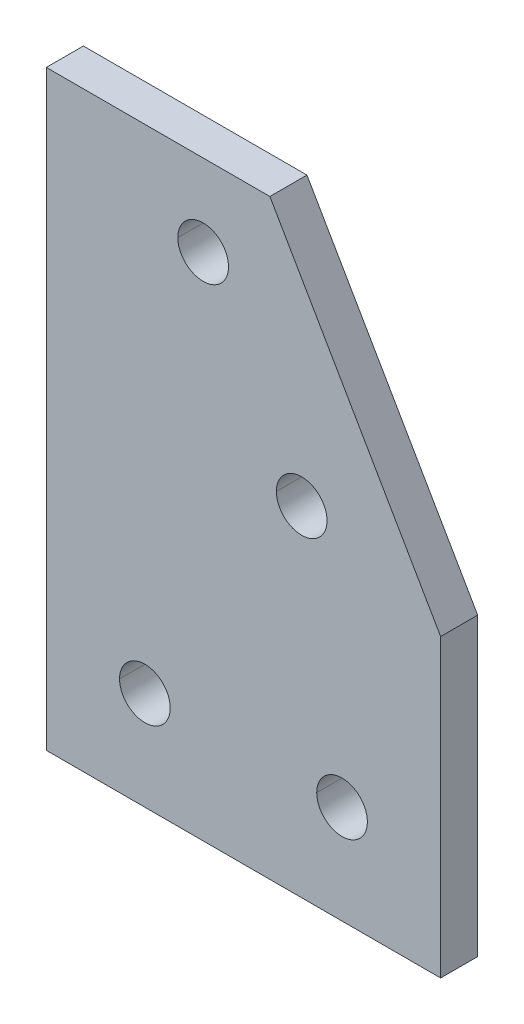
ISO-10303-21;
HEADER;
FILE_DESCRIPTION(('STEP AP214'),'2;1');
FILE_NAME('part.step','',(''),(''),'','','');
FILE_SCHEMA(('AUTOMOTIVE_DESIGN { 1 0 10303 214 1 1 1 1 }'));
ENDSEC;
DATA;
#1=APPLICATION_CONTEXT('core data for automotive mechanical design processes');
#2=APPLICATION_PROTOCOL_DEFINITION('international standard','automotive_design',2000,#1);
#3=PRODUCT_CONTEXT('',#1,'mechanical');
#4=PRODUCT('Part','Part','',(#3));
#5=PRODUCT_RELATED_PRODUCT_CATEGORY('part','',(#4));
#6=PRODUCT_DEFINITION_FORMATION('','',#4);
#7=PRODUCT_DEFINITION_CONTEXT('part definition',#1,'design');
#8=PRODUCT_DEFINITION('design','',#6,#7);
#9=PRODUCT_DEFINITION_SHAPE('','',#8);
#10=(LENGTH_UNIT() NAMED_UNIT(*) SI_UNIT(.MILLI.,.METRE.));
#11=(NAMED_UNIT(*) PLANE_ANGLE_UNIT() SI_UNIT($,.RADIAN.));
#12=(NAMED_UNIT(*) SI_UNIT($,.STERADIAN.) SOLID_ANGLE_UNIT());
#13=UNCERTAINTY_MEASURE_WITH_UNIT(LENGTH_MEASURE(1.E-05),#10,'distance_accuracy_value','');
#14=(GEOMETRIC_REPRESENTATION_CONTEXT(3) GLOBAL_UNCERTAINTY_ASSIGNED_CONTEXT((#13)) GLOBAL_UNIT_ASSIGNED_CONTEXT((#10,
#11,#12)) REPRESENTATION_CONTEXT('',''));
#15=CARTESIAN_POINT('',(0.,0.,0.));
#16=DIRECTION('',(0.,0.,1.));
#17=DIRECTION('',(1.,0.,0.));
#18=AXIS2_PLACEMENT_3D('',#15,#16,#17);
#19=CARTESIAN_POINT('',(-25.4,38.1,-2.3876));
#20=DIRECTION('',(0.,-1.,0.));
#21=DIRECTION('',(0.,0.,1.));
#22=AXIS2_PLACEMENT_3D('',#19,#20,#21);
#23=PLANE('',#22);
#24=DIRECTION('',(1.,0.,0.));
#25=VECTOR('',#24,1.);
#26=CARTESIAN_POINT('',(-25.4,38.1,2.3876));
#27=LINE('',#26,#25);
#28=CARTESIAN_POINT('',(-25.4,38.1,2.3876));
#29=VERTEX_POINT('',#28);
#30=CARTESIAN_POINT('',(3.402838,38.1,2.3876));
#31=VERTEX_POINT('',#30);
#32=EDGE_CURVE('E11',#29,#31,#27,.T.);
#33=ORIENTED_EDGE('',*,*,#32,.T.);
#34=DIRECTION('',(0.,0.,1.));
#35=VECTOR('',#34,1.);
#36=CARTESIAN_POINT('',(3.402838,38.1,-2.3876));
#37=LINE('',#36,#35);
#38=CARTESIAN_POINT('',(3.402838,38.1,-2.3876));
#39=VERTEX_POINT('',#38);
#40=EDGE_CURVE('E25',#39,#31,#37,.T.);
#41=ORIENTED_EDGE('',*,*,#40,.F.);
#42=DIRECTION('',(1.,0.,0.));
#43=VECTOR('',#42,1.);
#44=CARTESIAN_POINT('',(-25.4,38.1,-2.3876));
#45=LINE('',#44,#43);
#46=CARTESIAN_POINT('',(-25.4,38.1,-2.3876));
#47=VERTEX_POINT('',#46);
#48=EDGE_CURVE('E339',#47,#39,#45,.T.);
#49=ORIENTED_EDGE('',*,*,#48,.F.);
#50=DIRECTION('',(0.,0.,1.));
#51=VECTOR('',#50,1.);
#52=CARTESIAN_POINT('',(-25.4,38.1,-2.3876));
#53=LINE('',#52,#51);
#54=EDGE_CURVE('E334',#47,#29,#53,.T.);
#55=ORIENTED_EDGE('',*,*,#54,.T.);
#56=EDGE_LOOP('',(#33,#41,#49,#55));
#57=FACE_BOUND('',#56,.T.);
#58=ADVANCED_FACE('F16',(#57),#23,.F.);
#59=CARTESIAN_POINT('',(-25.4,-38.1,-2.3876));
#60=DIRECTION('',(1.,0.,0.));
#61=DIRECTION('',(0.,0.,-1.));
#62=AXIS2_PLACEMENT_3D('',#59,#60,#61);
#63=PLANE('',#62);
#64=DIRECTION('',(0.,1.,0.));
#65=VECTOR('',#64,1.);
#66=CARTESIAN_POINT('',(-25.4,-38.1,2.3876));
#67=LINE('',#66,#65);
#68=CARTESIAN_POINT('',(-25.4,-38.1,2.3876));
#69=VERTEX_POINT('',#68);
#70=EDGE_CURVE('E328',#69,#29,#67,.T.);
#71=ORIENTED_EDGE('',*,*,#70,.T.);
#72=ORIENTED_EDGE('',*,*,#54,.F.);
#73=DIRECTION('',(0.,1.,0.));
#74=VECTOR('',#73,1.);
#75=CARTESIAN_POINT('',(-25.4,-38.1,-2.3876));
#76=LINE('',#75,#74);
#77=CARTESIAN_POINT('',(-25.4,-38.1,-2.3876));
#78=VERTEX_POINT('',#77);
#79=EDGE_CURVE('E322',#78,#47,#76,.T.);
#80=ORIENTED_EDGE('',*,*,#79,.F.);
#81=DIRECTION('',(0.,0.,1.));
#82=VECTOR('',#81,1.);
#83=CARTESIAN_POINT('',(-25.4,-38.1,-2.3876));
#84=LINE('',#83,#82);
#85=EDGE_CURVE('E317',#78,#69,#84,.T.);
#86=ORIENTED_EDGE('',*,*,#85,.T.);
#87=EDGE_LOOP('',(#71,#72,#80,#86));
#88=FACE_BOUND('',#87,.T.);
#89=ADVANCED_FACE('F366',(#88),#63,.F.);
#90=CARTESIAN_POINT('',(25.4,-38.1,-2.3876));
#91=DIRECTION('',(0.,1.,0.));
#92=DIRECTION('',(0.,0.,-1.));
#93=AXIS2_PLACEMENT_3D('',#90,#91,#92);
#94=PLANE('',#93);
#95=DIRECTION('',(-1.,0.,0.));
#96=VECTOR('',#95,1.);
#97=CARTESIAN_POINT('',(25.4,-38.1,2.3876));
#98=LINE('',#97,#96);
#99=CARTESIAN_POINT('',(25.4,-38.1,2.3876));
#100=VERTEX_POINT('',#99);
#101=EDGE_CURVE('E311',#100,#69,#98,.T.);
#102=ORIENTED_EDGE('',*,*,#101,.T.);
#103=ORIENTED_EDGE('',*,*,#85,.F.);
#104=DIRECTION('',(-1.,0.,0.));
#105=VECTOR('',#104,1.);
#106=CARTESIAN_POINT('',(25.4,-38.1,-2.3876));
#107=LINE('',#106,#105);
#108=CARTESIAN_POINT('',(25.4,-38.1,-2.3876));
#109=VERTEX_POINT('',#108);
#110=EDGE_CURVE('E305',#109,#78,#107,.T.);
#111=ORIENTED_EDGE('',*,*,#110,.F.);
#112=DIRECTION('',(0.,0.,1.));
#113=VECTOR('',#112,1.);
#114=CARTESIAN_POINT('',(25.4,-38.1,-2.3876));
#115=LINE('',#114,#113);
#116=EDGE_CURVE('E300',#109,#100,#115,.T.);
#117=ORIENTED_EDGE('',*,*,#116,.T.);
#118=EDGE_LOOP('',(#102,#103,#111,#117));
#119=FACE_BOUND('',#118,.T.);
#120=ADVANCED_FACE('F369',(#119),#94,.F.);
#121=CARTESIAN_POINT('',(25.4,0.,-2.3876));
#122=DIRECTION('',(-1.,0.,0.));
#123=DIRECTION('',(0.,0.,1.));
#124=AXIS2_PLACEMENT_3D('',#121,#122,#123);
#125=PLANE('',#124);
#126=DIRECTION('',(0.,-1.,0.));
#127=VECTOR('',#126,1.);
#128=CARTESIAN_POINT('',(25.4,0.,2.3876));
#129=LINE('',#128,#127);
#130=CARTESIAN_POINT('',(25.4,0.,2.3876));
#131=VERTEX_POINT('',#130);
#132=EDGE_CURVE('E294',#131,#100,#129,.T.);
#133=ORIENTED_EDGE('',*,*,#132,.T.);
#134=ORIENTED_EDGE('',*,*,#116,.F.);
#135=DIRECTION('',(0.,-1.,0.));
#136=VECTOR('',#135,1.);
#137=CARTESIAN_POINT('',(25.4,0.,-2.3876));
#138=LINE('',#137,#136);
#139=CARTESIAN_POINT('',(25.4,0.,-2.3876));
#140=VERTEX_POINT('',#139);
#141=EDGE_CURVE('E288',#140,#109,#138,.T.);
#142=ORIENTED_EDGE('',*,*,#141,.F.);
#143=DIRECTION('',(0.,0.,1.));
#144=VECTOR('',#143,1.);
#145=CARTESIAN_POINT('',(25.4,0.,-2.3876));
#146=LINE('',#145,#144);
#147=EDGE_CURVE('E283',#140,#131,#146,.T.);
#148=ORIENTED_EDGE('',*,*,#147,.T.);
#149=EDGE_LOOP('',(#133,#134,#142,#148));
#150=FACE_BOUND('',#149,.T.);
#151=ADVANCED_FACE('F361',(#150),#125,.F.);
#152=CARTESIAN_POINT('',(3.402838,38.1,-2.3876));
#153=DIRECTION('',(-0.866024254729786,-0.500001990215758,0.));
#154=DIRECTION('',(-0.500001990215758,0.866024254729786,0.));
#155=AXIS2_PLACEMENT_3D('',#152,#153,#154);
#156=PLANE('',#155);
#157=DIRECTION('',(0.500001990215758,-0.866024254729786,0.));
#158=VECTOR('',#157,1.);
#159=CARTESIAN_POINT('',(3.402838,38.1,2.3876));
#160=LINE('',#159,#158);
#161=EDGE_CURVE('E277',#31,#131,#160,.T.);
#162=ORIENTED_EDGE('',*,*,#161,.T.);
#163=ORIENTED_EDGE('',*,*,#147,.F.);
#164=DIRECTION('',(0.500001990215758,-0.866024254729786,0.));
#165=VECTOR('',#164,1.);
#166=CARTESIAN_POINT('',(3.402838,38.1,-2.3876));
#167=LINE('',#166,#165);
#168=EDGE_CURVE('E271',#39,#140,#167,.T.);
#169=ORIENTED_EDGE('',*,*,#168,.F.);
#170=ORIENTED_EDGE('',*,*,#40,.T.);
#171=EDGE_LOOP('',(#162,#163,#169,#170));
#172=FACE_BOUND('',#171,.T.);
#173=ADVANCED_FACE('F353',(#172),#156,.F.);
#174=CARTESIAN_POINT('',(0.,-38.1,-2.3876));
#175=DIRECTION('',(0.,0.,-1.));
#176=DIRECTION('',(-1.,0.,0.));
#177=AXIS2_PLACEMENT_3D('',#174,#175,#176);
#178=PLANE('',#177);
#179=CARTESIAN_POINT('',(12.7,-25.4,-2.3876));
#180=DIRECTION('',(0.,0.,-1.));
#181=DIRECTION('',(-1.,0.,0.));
#182=AXIS2_PLACEMENT_3D('',#179,#180,#181);
#183=CIRCLE('',#182,3.2639);
#184=CARTESIAN_POINT('',(9.4361,-25.4,-2.3876));
#185=VERTEX_POINT('',#184);
#186=CARTESIAN_POINT('',(15.9639,-25.4,-2.3876));
#187=VERTEX_POINT('',#186);
#188=EDGE_CURVE('E265',#185,#187,#183,.T.);
#189=ORIENTED_EDGE('',*,*,#188,.F.);
#190=CARTESIAN_POINT('',(12.7,-25.4,-2.3876));
#191=DIRECTION('',(0.,0.,-1.));
#192=DIRECTION('',(-1.,0.,0.));
#193=AXIS2_PLACEMENT_3D('',#190,#191,#192);
#194=CIRCLE('',#193,3.2639);
#195=EDGE_CURVE('E259',#187,#185,#194,.T.);
#196=ORIENTED_EDGE('',*,*,#195,.F.);
#197=EDGE_LOOP('',(#189,#196));
#198=FACE_BOUND('',#197,.T.);
#199=CARTESIAN_POINT('',(7.49808,5.60832000000001,-2.3876));
#200=DIRECTION('',(0.,0.,-1.));
#201=DIRECTION('',(-1.,0.,0.));
#202=AXIS2_PLACEMENT_3D('',#199,#200,#201);
#203=CIRCLE('',#202,3.2639);
#204=CARTESIAN_POINT('',(4.23418,5.60832000000001,-2.3876));
#205=VERTEX_POINT('',#204);
#206=CARTESIAN_POINT('',(10.76198,5.60832000000001,-2.3876));
#207=VERTEX_POINT('',#206);
#208=EDGE_CURVE('E253',#205,#207,#203,.T.);
#209=ORIENTED_EDGE('',*,*,#208,.F.);
#210=CARTESIAN_POINT('',(7.49808,5.60832000000001,-2.3876));
#211=DIRECTION('',(0.,0.,-1.));
#212=DIRECTION('',(-1.,0.,0.));
#213=AXIS2_PLACEMENT_3D('',#210,#211,#212);
#214=CIRCLE('',#213,3.2639);
#215=EDGE_CURVE('E247',#207,#205,#214,.T.);
#216=ORIENTED_EDGE('',*,*,#215,.F.);
#217=EDGE_LOOP('',(#209,#216));
#218=FACE_BOUND('',#217,.T.);
#219=CARTESIAN_POINT('',(-5.1942999999999,27.5921670289711,-2.3876));
#220=DIRECTION('',(0.,0.,-1.));
#221=DIRECTION('',(-1.,0.,0.));
#222=AXIS2_PLACEMENT_3D('',#219,#220,#221);
#223=CIRCLE('',#222,3.2639);
#224=CARTESIAN_POINT('',(-8.4581999999999,27.5921670289711,-2.3876));
#225=VERTEX_POINT('',#224);
#226=CARTESIAN_POINT('',(-1.9303999999999,27.5921670289711,-2.3876));
#227=VERTEX_POINT('',#226);
#228=EDGE_CURVE('E242',#225,#227,#223,.T.);
#229=ORIENTED_EDGE('',*,*,#228,.F.);
#230=CARTESIAN_POINT('',(-5.1942999999999,27.5921670289711,-2.3876));
#231=DIRECTION('',(0.,0.,-1.));
#232=DIRECTION('',(-1.,0.,0.));
#233=AXIS2_PLACEMENT_3D('',#230,#231,#232);
#234=CIRCLE('',#233,3.2639);
#235=EDGE_CURVE('E123',#227,#225,#234,.T.);
#236=ORIENTED_EDGE('',*,*,#235,.F.);
#237=EDGE_LOOP('',(#229,#236));
#238=FACE_BOUND('',#237,.T.);
#239=CARTESIAN_POINT('',(-12.7,-25.4,-2.3876));
#240=DIRECTION('',(0.,0.,-1.));
#241=DIRECTION('',(-1.,0.,0.));
#242=AXIS2_PLACEMENT_3D('',#239,#240,#241);
#243=CIRCLE('',#242,3.2639);
#244=CARTESIAN_POINT('',(-15.9639,-25.4,-2.3876));
#245=VERTEX_POINT('',#244);
#246=CARTESIAN_POINT('',(-9.43610000000001,-25.4,-2.3876));
#247=VERTEX_POINT('',#246);
#248=EDGE_CURVE('E233',#245,#247,#243,.T.);
#249=ORIENTED_EDGE('',*,*,#248,.F.);
#250=CARTESIAN_POINT('',(-12.7,-25.4,-2.3876));
#251=DIRECTION('',(0.,0.,-1.));
#252=DIRECTION('',(-1.,0.,0.));
#253=AXIS2_PLACEMENT_3D('',#250,#251,#252);
#254=CIRCLE('',#253,3.2639);
#255=EDGE_CURVE('E228',#247,#245,#254,.T.);
#256=ORIENTED_EDGE('',*,*,#255,.F.);
#257=EDGE_LOOP('',(#249,#256));
#258=FACE_BOUND('',#257,.T.);
#259=ORIENTED_EDGE('',*,*,#168,.T.);
#260=ORIENTED_EDGE('',*,*,#141,.T.);
#261=ORIENTED_EDGE('',*,*,#110,.T.);
#262=ORIENTED_EDGE('',*,*,#79,.T.);
#263=ORIENTED_EDGE('',*,*,#48,.T.);
#264=EDGE_LOOP('',(#259,#260,#261,#262,#263));
#265=FACE_BOUND('',#264,.T.);
#266=ADVANCED_FACE('F363',(#198,#218,#238,#258,#265),#178,.T.);
#267=CARTESIAN_POINT('',(-12.7,-25.4,-2.3876));
#268=DIRECTION('',(0.,0.,-1.));
#269=DIRECTION('',(0.,1.,0.));
#270=AXIS2_PLACEMENT_3D('',#267,#268,#269);
#271=CYLINDRICAL_SURFACE('',#270,3.2639);
#272=CARTESIAN_POINT('',(-12.7,-25.4,2.3876));
#273=DIRECTION('',(0.,0.,-1.));
#274=DIRECTION('',(-1.,0.,0.));
#275=AXIS2_PLACEMENT_3D('',#272,#273,#274);
#276=CIRCLE('',#275,3.2639);
#277=CARTESIAN_POINT('',(-9.43610000000001,-25.4,2.3876));
#278=VERTEX_POINT('',#277);
#279=CARTESIAN_POINT('',(-15.9639,-25.4,2.3876));
#280=VERTEX_POINT('',#279);
#281=EDGE_CURVE('E224',#278,#280,#276,.T.);
#282=ORIENTED_EDGE('',*,*,#281,.F.);
#283=CARTESIAN_POINT('',(-9.43610000000001,-25.4,2.3876));
#284=DIRECTION('',(0.,0.,-1.));
#285=VECTOR('',#284,1.);
#286=LINE('',#283,#285);
#287=EDGE_CURVE('E201',#278,#247,#286,.T.);
#288=ORIENTED_EDGE('',*,*,#287,.T.);
#289=ORIENTED_EDGE('',*,*,#255,.T.);
#290=CARTESIAN_POINT('',(-15.9639,-25.4,2.3876));
#291=DIRECTION('',(0.,0.,-1.));
#292=VECTOR('',#291,1.);
#293=LINE('',#290,#292);
#294=EDGE_CURVE('E214',#280,#245,#293,.T.);
#295=ORIENTED_EDGE('',*,*,#294,.F.);
#296=EDGE_LOOP('',(#282,#288,#289,#295));
#297=FACE_BOUND('',#296,.T.);
#298=ADVANCED_FACE('F179',(#297),#271,.F.);
#299=CARTESIAN_POINT('',(-12.7,-25.4,-2.3876));
#300=DIRECTION('',(0.,0.,-1.));
#301=DIRECTION('',(0.,-1.,0.));
#302=AXIS2_PLACEMENT_3D('',#299,#300,#301);
#303=CYLINDRICAL_SURFACE('',#302,3.2639);
#304=ORIENTED_EDGE('',*,*,#248,.T.);
#305=ORIENTED_EDGE('',*,*,#287,.F.);
#306=CARTESIAN_POINT('',(-12.7,-25.4,2.3876));
#307=DIRECTION('',(0.,0.,-1.));
#308=DIRECTION('',(-1.,0.,0.));
#309=AXIS2_PLACEMENT_3D('',#306,#307,#308);
#310=CIRCLE('',#309,3.2639);
#311=EDGE_CURVE('E160',#280,#278,#310,.T.);
#312=ORIENTED_EDGE('',*,*,#311,.F.);
#313=ORIENTED_EDGE('',*,*,#294,.T.);
#314=EDGE_LOOP('',(#304,#305,#312,#313));
#315=FACE_BOUND('',#314,.T.);
#316=ADVANCED_FACE('F169',(#315),#303,.F.);
#317=CARTESIAN_POINT('',(0.,-38.1,2.3876));
#318=DIRECTION('',(0.,0.,-1.));
#319=DIRECTION('',(-1.,0.,0.));
#320=AXIS2_PLACEMENT_3D('',#317,#318,#319);
#321=PLANE('',#320);
#322=CARTESIAN_POINT('',(12.7,-25.4,2.3876));
#323=DIRECTION('',(0.,0.,-1.));
#324=DIRECTION('',(-1.,0.,0.));
#325=AXIS2_PLACEMENT_3D('',#322,#323,#324);
#326=CIRCLE('',#325,3.2639);
#327=CARTESIAN_POINT('',(9.4361,-25.4,2.3876));
#328=VERTEX_POINT('',#327);
#329=CARTESIAN_POINT('',(15.9639,-25.4,2.3876));
#330=VERTEX_POINT('',#329);
#331=EDGE_CURVE('E155',#328,#330,#326,.T.);
#332=ORIENTED_EDGE('',*,*,#331,.T.);
#333=CARTESIAN_POINT('',(12.7,-25.4,2.3876));
#334=DIRECTION('',(0.,0.,-1.));
#335=DIRECTION('',(-1.,0.,0.));
#336=AXIS2_PLACEMENT_3D('',#333,#334,#335);
#337=CIRCLE('',#336,3.2639);
#338=EDGE_CURVE('E150',#330,#328,#337,.T.);
#339=ORIENTED_EDGE('',*,*,#338,.T.);
#340=EDGE_LOOP('',(#332,#339));
#341=FACE_BOUND('',#340,.T.);
#342=CARTESIAN_POINT('',(7.49808,5.60832000000001,2.3876));
#343=DIRECTION('',(0.,0.,-1.));
#344=DIRECTION('',(-1.,0.,0.));
#345=AXIS2_PLACEMENT_3D('',#342,#343,#344);
#346=CIRCLE('',#345,3.2639);
#347=CARTESIAN_POINT('',(4.23418,5.60832000000001,2.3876));
#348=VERTEX_POINT('',#347);
#349=CARTESIAN_POINT('',(10.76198,5.60832000000001,2.3876));
#350=VERTEX_POINT('',#349);
#351=EDGE_CURVE('E139',#348,#350,#346,.T.);
#352=ORIENTED_EDGE('',*,*,#351,.T.);
#353=CARTESIAN_POINT('',(7.49808,5.60832000000001,2.3876));
#354=DIRECTION('',(0.,0.,-1.));
#355=DIRECTION('',(-1.,0.,0.));
#356=AXIS2_PLACEMENT_3D('',#353,#354,#355);
#357=CIRCLE('',#356,3.2639);
#358=EDGE_CURVE('E134',#350,#348,#357,.T.);
#359=ORIENTED_EDGE('',*,*,#358,.T.);
#360=EDGE_LOOP('',(#352,#359));
#361=FACE_BOUND('',#360,.T.);
#362=CARTESIAN_POINT('',(-5.1942999999999,27.5921670289711,2.3876));
#363=DIRECTION('',(0.,0.,-1.));
#364=DIRECTION('',(-1.,0.,0.));
#365=AXIS2_PLACEMENT_3D('',#362,#363,#364);
#366=CIRCLE('',#365,3.2639);
#367=CARTESIAN_POINT('',(-8.4581999999999,27.5921670289711,2.3876));
#368=VERTEX_POINT('',#367);
#369=CARTESIAN_POINT('',(-1.9303999999999,27.5921670289711,2.3876));
#370=VERTEX_POINT('',#369);
#371=EDGE_CURVE('E111',#368,#370,#366,.T.);
#372=ORIENTED_EDGE('',*,*,#371,.T.);
#373=CARTESIAN_POINT('',(-5.1942999999999,27.5921670289711,2.3876));
#374=DIRECTION('',(0.,0.,-1.));
#375=DIRECTION('',(-1.,0.,0.));
#376=AXIS2_PLACEMENT_3D('',#373,#374,#375);
#377=CIRCLE('',#376,3.2639);
#378=EDGE_CURVE('E106',#370,#368,#377,.T.);
#379=ORIENTED_EDGE('',*,*,#378,.T.);
#380=EDGE_LOOP('',(#372,#379));
#381=FACE_BOUND('',#380,.T.);
#382=ORIENTED_EDGE('',*,*,#311,.T.);
#383=ORIENTED_EDGE('',*,*,#281,.T.);
#384=EDGE_LOOP('',(#382,#383));
#385=FACE_BOUND('',#384,.T.);
#386=ORIENTED_EDGE('',*,*,#161,.F.);
#387=ORIENTED_EDGE('',*,*,#32,.F.);
#388=ORIENTED_EDGE('',*,*,#70,.F.);
#389=ORIENTED_EDGE('',*,*,#101,.F.);
#390=ORIENTED_EDGE('',*,*,#132,.F.);
#391=EDGE_LOOP('',(#386,#387,#388,#389,#390));
#392=FACE_BOUND('',#391,.T.);
#393=ADVANCED_FACE('F108',(#341,#361,#381,#385,#392),#321,.F.);
#394=CARTESIAN_POINT('',(-5.1942999999999,27.5921670289711,-2.3876));
#395=DIRECTION('',(0.,0.,-1.));
#396=DIRECTION('',(0.,1.,0.));
#397=AXIS2_PLACEMENT_3D('',#394,#395,#396);
#398=CYLINDRICAL_SURFACE('',#397,3.2639);
#399=ORIENTED_EDGE('',*,*,#378,.F.);
#400=CARTESIAN_POINT('',(-1.9303999999999,27.5921670289711,2.3876));
#401=DIRECTION('',(0.,0.,-1.));
#402=VECTOR('',#401,1.);
#403=LINE('',#400,#402);
#404=EDGE_CURVE('E116',#370,#227,#403,.T.);
#405=ORIENTED_EDGE('',*,*,#404,.T.);
#406=ORIENTED_EDGE('',*,*,#235,.T.);
#407=CARTESIAN_POINT('',(-8.4581999999999,27.5921670289711,2.3876));
#408=DIRECTION('',(0.,0.,-1.));
#409=VECTOR('',#408,1.);
#410=LINE('',#407,#409);
#411=EDGE_CURVE('E120',#368,#225,#410,.T.);
#412=ORIENTED_EDGE('',*,*,#411,.F.);
#413=EDGE_LOOP('',(#399,#405,#406,#412));
#414=FACE_BOUND('',#413,.T.);
#415=ADVANCED_FACE('F122',(#414),#398,.F.);
#416=CARTESIAN_POINT('',(-5.1942999999999,27.5921670289711,-2.3876));
#417=DIRECTION('',(0.,0.,-1.));
#418=DIRECTION('',(0.,-1.,0.));
#419=AXIS2_PLACEMENT_3D('',#416,#417,#418);
#420=CYLINDRICAL_SURFACE('',#419,3.2639);
#421=ORIENTED_EDGE('',*,*,#228,.T.);
#422=ORIENTED_EDGE('',*,*,#404,.F.);
#423=ORIENTED_EDGE('',*,*,#371,.F.);
#424=ORIENTED_EDGE('',*,*,#411,.T.);
#425=EDGE_LOOP('',(#421,#422,#423,#424));
#426=FACE_BOUND('',#425,.T.);
#427=ADVANCED_FACE('F131',(#426),#420,.F.);
#428=CARTESIAN_POINT('',(7.49808,5.60832000000001,-2.3876));
#429=DIRECTION('',(0.,0.,-1.));
#430=DIRECTION('',(0.,1.,0.));
#431=AXIS2_PLACEMENT_3D('',#428,#429,#430);
#432=CYLINDRICAL_SURFACE('',#431,3.2639);
#433=ORIENTED_EDGE('',*,*,#358,.F.);
#434=CARTESIAN_POINT('',(10.76198,5.60832000000001,2.3876));
#435=DIRECTION('',(0.,0.,-1.));
#436=VECTOR('',#435,1.);
#437=LINE('',#434,#436);
#438=EDGE_CURVE('E128',#350,#207,#437,.T.);
#439=ORIENTED_EDGE('',*,*,#438,.T.);
#440=ORIENTED_EDGE('',*,*,#215,.T.);
#441=CARTESIAN_POINT('',(4.23418,5.60832000000001,2.3876));
#442=DIRECTION('',(0.,0.,-1.));
#443=VECTOR('',#442,1.);
#444=LINE('',#441,#443);
#445=EDGE_CURVE('E729',#348,#205,#444,.T.);
#446=ORIENTED_EDGE('',*,*,#445,.F.);
#447=EDGE_LOOP('',(#433,#439,#440,#446));
#448=FACE_BOUND('',#447,.T.);
#449=ADVANCED_FACE('F474',(#448),#432,.F.);
#450=CARTESIAN_POINT('',(7.49808,5.60832000000001,-2.3876));
#451=DIRECTION('',(0.,0.,-1.));
#452=DIRECTION('',(0.,-1.,0.));
#453=AXIS2_PLACEMENT_3D('',#450,#451,#452);
#454=CYLINDRICAL_SURFACE('',#453,3.2639);
#455=ORIENTED_EDGE('',*,*,#208,.T.);
#456=ORIENTED_EDGE('',*,*,#438,.F.);
#457=ORIENTED_EDGE('',*,*,#351,.F.);
#458=ORIENTED_EDGE('',*,*,#445,.T.);
#459=EDGE_LOOP('',(#455,#456,#457,#458));
#460=FACE_BOUND('',#459,.T.);
#461=ADVANCED_FACE('F485',(#460),#454,.F.);
#462=CARTESIAN_POINT('',(12.7,-25.4,-2.3876));
#463=DIRECTION('',(0.,0.,-1.));
#464=DIRECTION('',(0.,1.,0.));
#465=AXIS2_PLACEMENT_3D('',#462,#463,#464);
#466=CYLINDRICAL_SURFACE('',#465,3.2639);
#467=ORIENTED_EDGE('',*,*,#338,.F.);
#468=CARTESIAN_POINT('',(15.9639,-25.4,2.3876));
#469=DIRECTION('',(0.,0.,-1.));
#470=VECTOR('',#469,1.);
#471=LINE('',#468,#470);
#472=EDGE_CURVE('E725',#330,#187,#471,.T.);
#473=ORIENTED_EDGE('',*,*,#472,.T.);
#474=ORIENTED_EDGE('',*,*,#195,.T.);
#475=CARTESIAN_POINT('',(9.4361,-25.4,2.3876));
#476=DIRECTION('',(0.,0.,-1.));
#477=VECTOR('',#476,1.);
#478=LINE('',#475,#477);
#479=EDGE_CURVE('E720',#328,#185,#478,.T.);
#480=ORIENTED_EDGE('',*,*,#479,.F.);
#481=EDGE_LOOP('',(#467,#473,#474,#480));
#482=FACE_BOUND('',#481,.T.);
#483=ADVANCED_FACE('F497',(#482),#466,.F.);
#484=CARTESIAN_POINT('',(12.7,-25.4,-2.3876));
#485=DIRECTION('',(0.,0.,-1.));
#486=DIRECTION('',(0.,-1.,0.));
#487=AXIS2_PLACEMENT_3D('',#484,#485,#486);
#488=CYLINDRICAL_SURFACE('',#487,3.2639);
#489=ORIENTED_EDGE('',*,*,#188,.T.);
#490=ORIENTED_EDGE('',*,*,#472,.F.);
#491=ORIENTED_EDGE('',*,*,#331,.F.);
#492=ORIENTED_EDGE('',*,*,#479,.T.);
#493=EDGE_LOOP('',(#489,#490,#491,#492));
#494=FACE_BOUND('',#493,.T.);
#495=ADVANCED_FACE('F509',(#494),#488,.F.);
#496=CLOSED_SHELL('',(#58,#89,#120,#151,#173,#266,#298,#316,#393,#415,#427,#449,#461,#483,#495));
#497=MANIFOLD_SOLID_BREP('B1',#496);
#498=ADVANCED_BREP_SHAPE_REPRESENTATION('',(#18,#497),#14);
#499=SHAPE_DEFINITION_REPRESENTATION(#9,#498);
ENDSEC;
END-ISO-10303-21;
